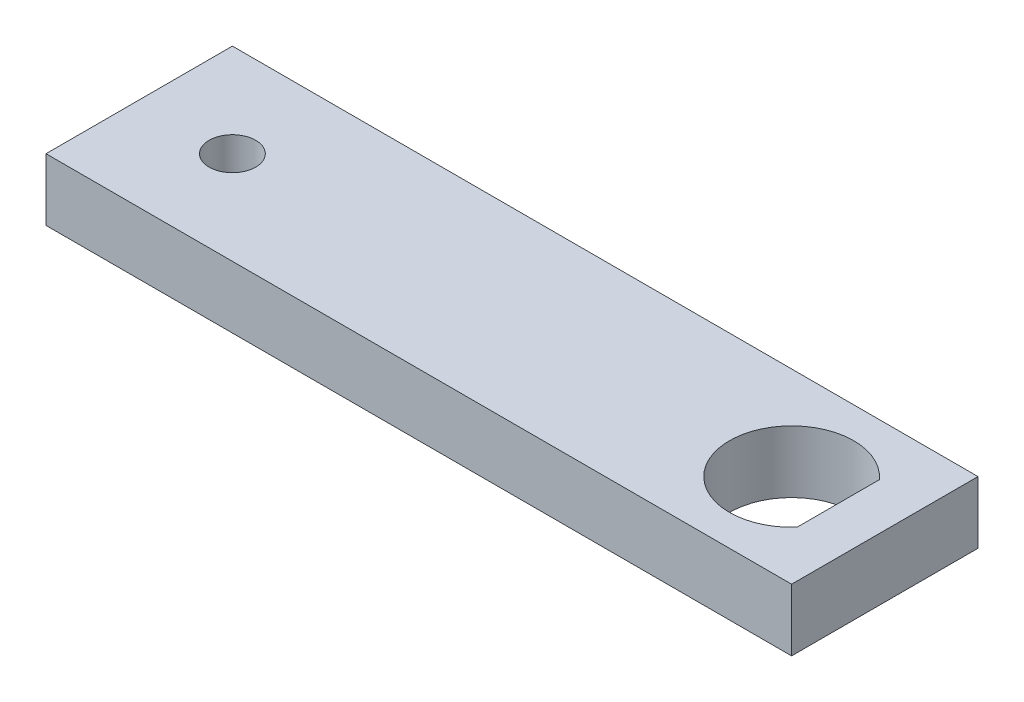
ISO-10303-21;
HEADER;
FILE_DESCRIPTION(('STEP AP214'),'2;1');
FILE_NAME('part.step','',(''),(''),'','','');
FILE_SCHEMA(('AUTOMOTIVE_DESIGN { 1 0 10303 214 1 1 1 1 }'));
ENDSEC;
DATA;
#1=APPLICATION_CONTEXT('core data for automotive mechanical design processes');
#2=APPLICATION_PROTOCOL_DEFINITION('international standard','automotive_design',2000,#1);
#3=PRODUCT_CONTEXT('',#1,'mechanical');
#4=PRODUCT('Part','Part','',(#3));
#5=PRODUCT_RELATED_PRODUCT_CATEGORY('part','',(#4));
#6=PRODUCT_DEFINITION_FORMATION('','',#4);
#7=PRODUCT_DEFINITION_CONTEXT('part definition',#1,'design');
#8=PRODUCT_DEFINITION('design','',#6,#7);
#9=PRODUCT_DEFINITION_SHAPE('','',#8);
#10=(LENGTH_UNIT() NAMED_UNIT(*) SI_UNIT(.MILLI.,.METRE.));
#11=(NAMED_UNIT(*) PLANE_ANGLE_UNIT() SI_UNIT($,.RADIAN.));
#12=(NAMED_UNIT(*) SI_UNIT($,.STERADIAN.) SOLID_ANGLE_UNIT());
#13=UNCERTAINTY_MEASURE_WITH_UNIT(LENGTH_MEASURE(1.E-05),#10,'distance_accuracy_value','');
#14=(GEOMETRIC_REPRESENTATION_CONTEXT(3) GLOBAL_UNCERTAINTY_ASSIGNED_CONTEXT((#13)) GLOBAL_UNIT_ASSIGNED_CONTEXT((#10,
#11,#12)) REPRESENTATION_CONTEXT('',''));
#15=CARTESIAN_POINT('',(0.,0.,0.));
#16=DIRECTION('',(0.,0.,1.));
#17=DIRECTION('',(1.,0.,0.));
#18=AXIS2_PLACEMENT_3D('',#15,#16,#17);
#19=CARTESIAN_POINT('',(0.,0.,19.05));
#20=DIRECTION('',(-1.,0.,0.));
#21=DIRECTION('',(0.,0.,1.));
#22=AXIS2_PLACEMENT_3D('',#19,#20,#21);
#23=PLANE('',#22);
#24=DIRECTION('',(0.,1.,0.));
#25=VECTOR('',#24,1.);
#26=CARTESIAN_POINT('',(0.,0.,0.));
#27=LINE('',#26,#25);
#28=CARTESIAN_POINT('',(0.,0.,0.));
#29=VERTEX_POINT('',#28);
#30=CARTESIAN_POINT('',(0.,6.35000000000001,0.));
#31=VERTEX_POINT('',#30);
#32=EDGE_CURVE('E112',#29,#31,#27,.T.);
#33=ORIENTED_EDGE('',*,*,#32,.F.);
#34=DIRECTION('',(0.,0.,-1.));
#35=VECTOR('',#34,1.);
#36=CARTESIAN_POINT('',(0.,0.,19.05));
#37=LINE('',#36,#35);
#38=CARTESIAN_POINT('',(0.,0.,19.05));
#39=VERTEX_POINT('',#38);
#40=EDGE_CURVE('E11',#39,#29,#37,.T.);
#41=ORIENTED_EDGE('',*,*,#40,.F.);
#42=DIRECTION('',(0.,1.,0.));
#43=VECTOR('',#42,1.);
#44=CARTESIAN_POINT('',(0.,0.,19.05));
#45=LINE('',#44,#43);
#46=CARTESIAN_POINT('',(0.,6.35000000000001,19.05));
#47=VERTEX_POINT('',#46);
#48=EDGE_CURVE('E114',#39,#47,#45,.T.);
#49=ORIENTED_EDGE('',*,*,#48,.T.);
#50=DIRECTION('',(0.,0.,-1.));
#51=VECTOR('',#50,1.);
#52=CARTESIAN_POINT('',(0.,6.35000000000001,19.05));
#53=LINE('',#52,#51);
#54=EDGE_CURVE('E42',#47,#31,#53,.T.);
#55=ORIENTED_EDGE('',*,*,#54,.T.);
#56=EDGE_LOOP('',(#33,#41,#49,#55));
#57=FACE_BOUND('',#56,.T.);
#58=ADVANCED_FACE('F39',(#57),#23,.T.);
#59=CARTESIAN_POINT('',(0.,0.,19.05));
#60=DIRECTION('',(0.,1.,0.));
#61=DIRECTION('',(-1.,0.,0.));
#62=AXIS2_PLACEMENT_3D('',#59,#60,#61);
#63=PLANE('',#62);
#64=CARTESIAN_POINT('',(9.525,0.,9.525));
#65=DIRECTION('',(0.,1.,0.));
#66=DIRECTION('',(-1.,0.,0.));
#67=AXIS2_PLACEMENT_3D('',#64,#65,#66);
#68=CIRCLE('',#67,2.38125);
#69=CARTESIAN_POINT('',(7.14375,0.,9.525));
#70=VERTEX_POINT('',#69);
#71=EDGE_CURVE('E110',#70,#70,#68,.T.);
#72=ORIENTED_EDGE('',*,*,#71,.T.);
#73=EDGE_LOOP('',(#72));
#74=FACE_BOUND('',#73,.T.);
#75=DIRECTION('',(0.,0.,1.));
#76=VECTOR('',#75,1.);
#77=CARTESIAN_POINT('',(71.4375,0.,5.32486979368495));
#78=LINE('',#77,#76);
#79=CARTESIAN_POINT('',(71.4375,0.,5.32486979368495));
#80=VERTEX_POINT('',#79);
#81=CARTESIAN_POINT('',(71.4375,0.,13.7251302063151));
#82=VERTEX_POINT('',#81);
#83=EDGE_CURVE('E91',#80,#82,#78,.T.);
#84=ORIENTED_EDGE('',*,*,#83,.F.);
#85=CARTESIAN_POINT('',(66.675,0.,9.525));
#86=DIRECTION('',(0.,1.,0.));
#87=DIRECTION('',(-1.,0.,0.));
#88=AXIS2_PLACEMENT_3D('',#85,#86,#87);
#89=CIRCLE('',#88,6.35);
#90=EDGE_CURVE('E55',#80,#82,#89,.T.);
#91=ORIENTED_EDGE('',*,*,#90,.T.);
#92=EDGE_LOOP('',(#84,#91));
#93=FACE_BOUND('',#92,.T.);
#94=DIRECTION('',(1.,0.,0.));
#95=VECTOR('',#94,1.);
#96=CARTESIAN_POINT('',(0.,0.,0.));
#97=LINE('',#96,#95);
#98=CARTESIAN_POINT('',(76.2,0.,0.));
#99=VERTEX_POINT('',#98);
#100=EDGE_CURVE('E118',#29,#99,#97,.T.);
#101=ORIENTED_EDGE('',*,*,#100,.T.);
#102=DIRECTION('',(0.,0.,-1.));
#103=VECTOR('',#102,1.);
#104=CARTESIAN_POINT('',(76.2,0.,19.05));
#105=LINE('',#104,#103);
#106=CARTESIAN_POINT('',(76.2,0.,19.05));
#107=VERTEX_POINT('',#106);
#108=EDGE_CURVE('E47',#107,#99,#105,.T.);
#109=ORIENTED_EDGE('',*,*,#108,.F.);
#110=DIRECTION('',(1.,0.,0.));
#111=VECTOR('',#110,1.);
#112=CARTESIAN_POINT('',(0.,0.,19.05));
#113=LINE('',#112,#111);
#114=EDGE_CURVE('E123',#39,#107,#113,.T.);
#115=ORIENTED_EDGE('',*,*,#114,.F.);
#116=ORIENTED_EDGE('',*,*,#40,.T.);
#117=EDGE_LOOP('',(#101,#109,#115,#116));
#118=FACE_BOUND('',#117,.T.);
#119=ADVANCED_FACE('F101',(#74,#93,#118),#63,.F.);
#120=CARTESIAN_POINT('',(76.2,6.35,19.05));
#121=DIRECTION('',(1.,0.,0.));
#122=DIRECTION('',(0.,0.,-1.));
#123=AXIS2_PLACEMENT_3D('',#120,#121,#122);
#124=PLANE('',#123);
#125=DIRECTION('',(0.,-1.,0.));
#126=VECTOR('',#125,1.);
#127=CARTESIAN_POINT('',(76.2,6.35,0.));
#128=LINE('',#127,#126);
#129=CARTESIAN_POINT('',(76.2,6.35,0.));
#130=VERTEX_POINT('',#129);
#131=EDGE_CURVE('E130',#130,#99,#128,.T.);
#132=ORIENTED_EDGE('',*,*,#131,.F.);
#133=DIRECTION('',(0.,0.,-1.));
#134=VECTOR('',#133,1.);
#135=CARTESIAN_POINT('',(76.2,6.35,19.05));
#136=LINE('',#135,#134);
#137=CARTESIAN_POINT('',(76.2,6.35,19.05));
#138=VERTEX_POINT('',#137);
#139=EDGE_CURVE('E136',#138,#130,#136,.T.);
#140=ORIENTED_EDGE('',*,*,#139,.F.);
#141=DIRECTION('',(0.,-1.,0.));
#142=VECTOR('',#141,1.);
#143=CARTESIAN_POINT('',(76.2,6.35,19.05));
#144=LINE('',#143,#142);
#145=EDGE_CURVE('E120',#138,#107,#144,.T.);
#146=ORIENTED_EDGE('',*,*,#145,.T.);
#147=ORIENTED_EDGE('',*,*,#108,.T.);
#148=EDGE_LOOP('',(#132,#140,#146,#147));
#149=FACE_BOUND('',#148,.T.);
#150=ADVANCED_FACE('F155',(#149),#124,.T.);
#151=CARTESIAN_POINT('',(76.2,6.35,19.05));
#152=DIRECTION('',(0.,-1.,0.));
#153=DIRECTION('',(1.,0.,0.));
#154=AXIS2_PLACEMENT_3D('',#151,#152,#153);
#155=PLANE('',#154);
#156=CARTESIAN_POINT('',(9.525,6.35000000000001,9.525));
#157=DIRECTION('',(0.,1.,0.));
#158=DIRECTION('',(-1.,0.,0.));
#159=AXIS2_PLACEMENT_3D('',#156,#157,#158);
#160=CIRCLE('',#159,2.38125);
#161=CARTESIAN_POINT('',(7.14375,6.35000000000001,9.525));
#162=VERTEX_POINT('',#161);
#163=EDGE_CURVE('E107',#162,#162,#160,.T.);
#164=ORIENTED_EDGE('',*,*,#163,.F.);
#165=EDGE_LOOP('',(#164));
#166=FACE_BOUND('',#165,.T.);
#167=DIRECTION('',(0.,0.,1.));
#168=VECTOR('',#167,1.);
#169=CARTESIAN_POINT('',(71.4375,6.35,5.32486979368495));
#170=LINE('',#169,#168);
#171=CARTESIAN_POINT('',(71.4375,6.35,5.32486979368495));
#172=VERTEX_POINT('',#171);
#173=CARTESIAN_POINT('',(71.4375,6.35,13.7251302063151));
#174=VERTEX_POINT('',#173);
#175=EDGE_CURVE('E103',#172,#174,#170,.T.);
#176=ORIENTED_EDGE('',*,*,#175,.T.);
#177=CARTESIAN_POINT('',(66.675,6.35,9.525));
#178=DIRECTION('',(0.,1.,0.));
#179=DIRECTION('',(-1.,0.,0.));
#180=AXIS2_PLACEMENT_3D('',#177,#178,#179);
#181=CIRCLE('',#180,6.35);
#182=EDGE_CURVE('E60',#172,#174,#181,.T.);
#183=ORIENTED_EDGE('',*,*,#182,.F.);
#184=EDGE_LOOP('',(#176,#183));
#185=FACE_BOUND('',#184,.T.);
#186=DIRECTION('',(-1.,0.,0.));
#187=VECTOR('',#186,1.);
#188=CARTESIAN_POINT('',(76.2,6.35,0.));
#189=LINE('',#188,#187);
#190=EDGE_CURVE('E127',#130,#31,#189,.T.);
#191=ORIENTED_EDGE('',*,*,#190,.T.);
#192=ORIENTED_EDGE('',*,*,#54,.F.);
#193=DIRECTION('',(-1.,0.,0.));
#194=VECTOR('',#193,1.);
#195=CARTESIAN_POINT('',(76.2,6.35,19.05));
#196=LINE('',#195,#194);
#197=EDGE_CURVE('E117',#138,#47,#196,.T.);
#198=ORIENTED_EDGE('',*,*,#197,.F.);
#199=ORIENTED_EDGE('',*,*,#139,.T.);
#200=EDGE_LOOP('',(#191,#192,#198,#199));
#201=FACE_BOUND('',#200,.T.);
#202=ADVANCED_FACE('F144',(#166,#185,#201),#155,.F.);
#203=CARTESIAN_POINT('',(0.,0.,19.05));
#204=DIRECTION('',(0.,0.,-1.));
#205=DIRECTION('',(-1.,0.,0.));
#206=AXIS2_PLACEMENT_3D('',#203,#204,#205);
#207=PLANE('',#206);
#208=ORIENTED_EDGE('',*,*,#48,.F.);
#209=ORIENTED_EDGE('',*,*,#114,.T.);
#210=ORIENTED_EDGE('',*,*,#145,.F.);
#211=ORIENTED_EDGE('',*,*,#197,.T.);
#212=EDGE_LOOP('',(#208,#209,#210,#211));
#213=FACE_BOUND('',#212,.T.);
#214=ADVANCED_FACE('F153',(#213),#207,.F.);
#215=CARTESIAN_POINT('',(0.,0.,0.));
#216=DIRECTION('',(0.,0.,-1.));
#217=DIRECTION('',(-1.,0.,0.));
#218=AXIS2_PLACEMENT_3D('',#215,#216,#217);
#219=PLANE('',#218);
#220=ORIENTED_EDGE('',*,*,#32,.T.);
#221=ORIENTED_EDGE('',*,*,#190,.F.);
#222=ORIENTED_EDGE('',*,*,#131,.T.);
#223=ORIENTED_EDGE('',*,*,#100,.F.);
#224=EDGE_LOOP('',(#220,#221,#222,#223));
#225=FACE_BOUND('',#224,.T.);
#226=ADVANCED_FACE('F148',(#225),#219,.T.);
#227=CARTESIAN_POINT('',(66.675,0.,9.525));
#228=DIRECTION('',(0.,1.,0.));
#229=DIRECTION('',(-1.,0.,0.));
#230=AXIS2_PLACEMENT_3D('',#227,#228,#229);
#231=CYLINDRICAL_SURFACE('',#230,6.35);
#232=ORIENTED_EDGE('',*,*,#182,.T.);
#233=DIRECTION('',(0.,1.,0.));
#234=VECTOR('',#233,1.);
#235=CARTESIAN_POINT('',(71.4375,0.,13.7251302063151));
#236=LINE('',#235,#234);
#237=EDGE_CURVE('E94',#82,#174,#236,.T.);
#238=ORIENTED_EDGE('',*,*,#237,.F.);
#239=ORIENTED_EDGE('',*,*,#90,.F.);
#240=DIRECTION('',(0.,1.,0.));
#241=VECTOR('',#240,1.);
#242=CARTESIAN_POINT('',(71.4375,0.,5.32486979368495));
#243=LINE('',#242,#241);
#244=EDGE_CURVE('E96',#80,#172,#243,.T.);
#245=ORIENTED_EDGE('',*,*,#244,.T.);
#246=EDGE_LOOP('',(#232,#238,#239,#245));
#247=FACE_BOUND('',#246,.T.);
#248=ADVANCED_FACE('F99',(#247),#231,.F.);
#249=CARTESIAN_POINT('',(71.4375,0.,5.32486979368495));
#250=DIRECTION('',(-1.,0.,0.));
#251=DIRECTION('',(0.,-1.,0.));
#252=AXIS2_PLACEMENT_3D('',#249,#250,#251);
#253=PLANE('',#252);
#254=ORIENTED_EDGE('',*,*,#175,.F.);
#255=ORIENTED_EDGE('',*,*,#244,.F.);
#256=ORIENTED_EDGE('',*,*,#83,.T.);
#257=ORIENTED_EDGE('',*,*,#237,.T.);
#258=EDGE_LOOP('',(#254,#255,#256,#257));
#259=FACE_BOUND('',#258,.T.);
#260=ADVANCED_FACE('F93',(#259),#253,.T.);
#261=CARTESIAN_POINT('',(9.525,0.,9.525));
#262=DIRECTION('',(0.,1.,0.));
#263=DIRECTION('',(-1.,0.,0.));
#264=AXIS2_PLACEMENT_3D('',#261,#262,#263);
#265=CYLINDRICAL_SURFACE('',#264,2.38125);
#266=CARTESIAN_POINT('',(7.14375,0.,9.525));
#267=CARTESIAN_POINT('',(7.14375,0.0661458333333243,9.525));
#268=CARTESIAN_POINT('',(7.14375,0.132291666666658,9.525));
#269=CARTESIAN_POINT('',(7.14375,0.264583333333325,9.525));
#270=CARTESIAN_POINT('',(7.14375,0.330729166666659,9.525));
#271=CARTESIAN_POINT('',(7.14375,0.463020833333326,9.525));
#272=CARTESIAN_POINT('',(7.14375,0.529166666666659,9.525));
#273=CARTESIAN_POINT('',(7.14375,0.661458333333326,9.525));
#274=CARTESIAN_POINT('',(7.14375,0.72760416666666,9.525));
#275=CARTESIAN_POINT('',(7.14375,0.859895833333327,9.525));
#276=CARTESIAN_POINT('',(7.14375,0.926041666666661,9.525));
#277=CARTESIAN_POINT('',(7.14375,1.05833333333333,9.525));
#278=CARTESIAN_POINT('',(7.14375,1.12447916666666,9.525));
#279=CARTESIAN_POINT('',(7.14375,1.25677083333333,9.525));
#280=CARTESIAN_POINT('',(7.14375,1.32291666666666,9.525));
#281=CARTESIAN_POINT('',(7.14375,1.45520833333333,9.525));
#282=CARTESIAN_POINT('',(7.14375,1.52135416666666,9.525));
#283=CARTESIAN_POINT('',(7.14375,1.65364583333333,9.525));
#284=CARTESIAN_POINT('',(7.14375,1.71979166666666,9.525));
#285=CARTESIAN_POINT('',(7.14375,1.85208333333333,9.525));
#286=CARTESIAN_POINT('',(7.14375,1.91822916666666,9.525));
#287=CARTESIAN_POINT('',(7.14375,2.05052083333333,9.525));
#288=CARTESIAN_POINT('',(7.14375,2.11666666666666,9.525));
#289=CARTESIAN_POINT('',(7.14375,2.24895833333333,9.525));
#290=CARTESIAN_POINT('',(7.14375,2.31510416666667,9.525));
#291=CARTESIAN_POINT('',(7.14375,2.44739583333333,9.525));
#292=CARTESIAN_POINT('',(7.14375,2.51354166666667,9.525));
#293=CARTESIAN_POINT('',(7.14375,2.64583333333333,9.525));
#294=CARTESIAN_POINT('',(7.14375,2.71197916666667,9.525));
#295=CARTESIAN_POINT('',(7.14375,2.84427083333333,9.525));
#296=CARTESIAN_POINT('',(7.14375,2.91041666666667,9.525));
#297=CARTESIAN_POINT('',(7.14375,3.04270833333334,9.525));
#298=CARTESIAN_POINT('',(7.14375,3.10885416666667,9.525));
#299=CARTESIAN_POINT('',(7.14375,3.24114583333334,9.525));
#300=CARTESIAN_POINT('',(7.14375,3.30729166666667,9.525));
#301=CARTESIAN_POINT('',(7.14375,3.43958333333334,9.525));
#302=CARTESIAN_POINT('',(7.14375,3.50572916666667,9.525));
#303=CARTESIAN_POINT('',(7.14375,3.63802083333334,9.525));
#304=CARTESIAN_POINT('',(7.14375,3.70416666666667,9.525));
#305=CARTESIAN_POINT('',(7.14375,3.83645833333334,9.525));
#306=CARTESIAN_POINT('',(7.14375,3.90260416666667,9.525));
#307=CARTESIAN_POINT('',(7.14375,4.03489583333334,9.525));
#308=CARTESIAN_POINT('',(7.14375,4.10104166666667,9.525));
#309=CARTESIAN_POINT('',(7.14375,4.23333333333334,9.525));
#310=CARTESIAN_POINT('',(7.14375,4.29947916666667,9.525));
#311=CARTESIAN_POINT('',(7.14375,4.43177083333334,9.525));
#312=CARTESIAN_POINT('',(7.14375,4.49791666666667,9.525));
#313=CARTESIAN_POINT('',(7.14375,4.63020833333334,9.525));
#314=CARTESIAN_POINT('',(7.14375,4.69635416666667,9.525));
#315=CARTESIAN_POINT('',(7.14375,4.82864583333334,9.525));
#316=CARTESIAN_POINT('',(7.14375,4.89479166666668,9.525));
#317=CARTESIAN_POINT('',(7.14375,5.02708333333334,9.525));
#318=CARTESIAN_POINT('',(7.14375,5.09322916666668,9.525));
#319=CARTESIAN_POINT('',(7.14375,5.22552083333334,9.525));
#320=CARTESIAN_POINT('',(7.14375,5.29166666666668,9.525));
#321=CARTESIAN_POINT('',(7.14375,5.42395833333334,9.525));
#322=CARTESIAN_POINT('',(7.14375,5.49010416666668,9.525));
#323=CARTESIAN_POINT('',(7.14375,5.62239583333334,9.525));
#324=CARTESIAN_POINT('',(7.14375,5.68854166666668,9.525));
#325=CARTESIAN_POINT('',(7.14375,5.82083333333335,9.525));
#326=CARTESIAN_POINT('',(7.14375,5.88697916666668,9.525));
#327=CARTESIAN_POINT('',(7.14375,6.01927083333335,9.525));
#328=CARTESIAN_POINT('',(7.14375,6.08541666666668,9.525));
#329=CARTESIAN_POINT('',(7.14375,6.21770833333335,9.525));
#330=CARTESIAN_POINT('',(7.14375,6.28385416666668,9.525));
#331=CARTESIAN_POINT('',(7.14375,6.35000000000001,9.525));
#332=B_SPLINE_CURVE_WITH_KNOTS('',3,(#266,#267,#268,#269,#270,#271,#272,#273,#274,#275,#276,
#277,#278,#279,#280,#281,#282,#283,#284,#285,#286,#287,#288,#289,#290,#291,#292,#293,#294,#295,
#296,#297,#298,#299,#300,#301,#302,#303,#304,#305,#306,#307,#308,#309,#310,#311,#312,#313,#314,
#315,#316,#317,#318,#319,#320,#321,#322,#323,#324,#325,#326,#327,#328,#329,#330,#331),
.UNSPECIFIED.,.F.,.F.,(4,2,2,2,2,2,2,2,2,2,2,2,2,2,2,2,2,2,2,2,2,2,2,2,2,2,2,2,2,2,2,2,4),(0.,
0.198437500000001,0.396875000000001,0.595312500000002,0.793750000000003,0.992187500000003,
1.190625,1.38906250000001,1.58750000000001,1.78593750000001,1.98437500000001,2.18281250000001,
2.38125000000001,2.57968750000001,2.77812500000001,2.97656250000001,3.17500000000001,
3.37343750000001,3.57187500000001,3.77031250000001,3.96875000000001,4.16718750000001,
4.36562500000002,4.56406250000002,4.76250000000002,4.96093750000002,5.15937500000002,
5.35781250000002,5.55625000000002,5.75468750000002,5.95312500000002,6.15156250000002,
6.35000000000002),.UNSPECIFIED.);
#333=EDGE_CURVE('BSEAM201',#70,#162,#332,.T.);
#334=ORIENTED_EDGE('',*,*,#71,.F.);
#335=ORIENTED_EDGE('',*,*,#163,.T.);
#336=ORIENTED_EDGE('',*,*,#333,.T.);
#337=ORIENTED_EDGE('',*,*,#333,.F.);
#338=EDGE_LOOP('',(#334,#336,#335,#337));
#339=FACE_BOUND('',#338,.T.);
#340=ADVANCED_FACE('F201',(#339),#265,.F.);
#341=CLOSED_SHELL('',(#58,#119,#150,#202,#214,#226,#248,#260,#340));
#342=MANIFOLD_SOLID_BREP('B2',#341);
#343=ADVANCED_BREP_SHAPE_REPRESENTATION('',(#18,#342),#14);
#344=SHAPE_DEFINITION_REPRESENTATION(#9,#343);
ENDSEC;
END-ISO-10303-21;
